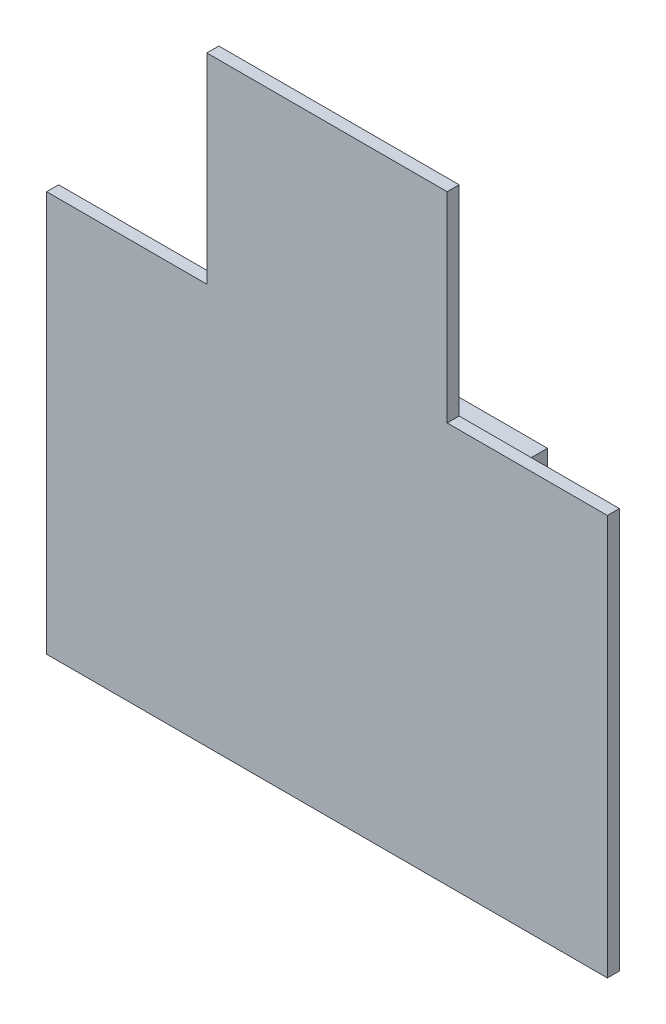
ISO-10303-21;
HEADER;
FILE_DESCRIPTION(('STEP AP214'),'2;1');
FILE_NAME('part.step','',(''),(''),'','','');
FILE_SCHEMA(('AUTOMOTIVE_DESIGN { 1 0 10303 214 1 1 1 1 }'));
ENDSEC;
DATA;
#1=APPLICATION_CONTEXT('core data for automotive mechanical design processes');
#2=APPLICATION_PROTOCOL_DEFINITION('international standard','automotive_design',2000,#1);
#3=PRODUCT_CONTEXT('',#1,'mechanical');
#4=PRODUCT('Part','Part','',(#3));
#5=PRODUCT_RELATED_PRODUCT_CATEGORY('part','',(#4));
#6=PRODUCT_DEFINITION_FORMATION('','',#4);
#7=PRODUCT_DEFINITION_CONTEXT('part definition',#1,'design');
#8=PRODUCT_DEFINITION('design','',#6,#7);
#9=PRODUCT_DEFINITION_SHAPE('','',#8);
#10=(LENGTH_UNIT() NAMED_UNIT(*) SI_UNIT(.MILLI.,.METRE.));
#11=(NAMED_UNIT(*) PLANE_ANGLE_UNIT() SI_UNIT($,.RADIAN.));
#12=(NAMED_UNIT(*) SI_UNIT($,.STERADIAN.) SOLID_ANGLE_UNIT());
#13=UNCERTAINTY_MEASURE_WITH_UNIT(LENGTH_MEASURE(1.E-05),#10,'distance_accuracy_value','');
#14=(GEOMETRIC_REPRESENTATION_CONTEXT(3) GLOBAL_UNCERTAINTY_ASSIGNED_CONTEXT((#13)) GLOBAL_UNIT_ASSIGNED_CONTEXT((#10,
#11,#12)) REPRESENTATION_CONTEXT('',''));
#15=CARTESIAN_POINT('',(0.,0.,0.));
#16=DIRECTION('',(0.,0.,1.));
#17=DIRECTION('',(1.,0.,0.));
#18=AXIS2_PLACEMENT_3D('',#15,#16,#17);
#19=CARTESIAN_POINT('',(0.,0.,0.));
#20=DIRECTION('',(0.,0.,-1.));
#21=DIRECTION('',(-1.,0.,0.));
#22=AXIS2_PLACEMENT_3D('',#19,#20,#21);
#23=PLANE('',#22);
#24=DIRECTION('',(0.,1.,0.));
#25=VECTOR('',#24,1.);
#26=CARTESIAN_POINT('',(-70.,-50.,0.));
#27=LINE('',#26,#25);
#28=CARTESIAN_POINT('',(-70.,-50.,0.));
#29=VERTEX_POINT('',#28);
#30=CARTESIAN_POINT('',(-70.,50.,0.));
#31=VERTEX_POINT('',#30);
#32=EDGE_CURVE('E180',#29,#31,#27,.T.);
#33=ORIENTED_EDGE('',*,*,#32,.T.);
#34=DIRECTION('',(1.,0.,0.));
#35=VECTOR('',#34,1.);
#36=CARTESIAN_POINT('',(-70.,50.,0.));
#37=LINE('',#36,#35);
#38=CARTESIAN_POINT('',(-30.,50.,0.));
#39=VERTEX_POINT('',#38);
#40=EDGE_CURVE('E197',#31,#39,#37,.T.);
#41=ORIENTED_EDGE('',*,*,#40,.T.);
#42=DIRECTION('',(0.,-1.,0.));
#43=VECTOR('',#42,1.);
#44=CARTESIAN_POINT('',(-30.,100.,0.));
#45=LINE('',#44,#43);
#46=CARTESIAN_POINT('',(-30.,100.,0.));
#47=VERTEX_POINT('',#46);
#48=EDGE_CURVE('E177',#47,#39,#45,.T.);
#49=ORIENTED_EDGE('',*,*,#48,.F.);
#50=DIRECTION('',(-1.,0.,0.));
#51=VECTOR('',#50,1.);
#52=CARTESIAN_POINT('',(30.,100.,0.));
#53=LINE('',#52,#51);
#54=CARTESIAN_POINT('',(30.,100.,0.));
#55=VERTEX_POINT('',#54);
#56=EDGE_CURVE('E158',#55,#47,#53,.T.);
#57=ORIENTED_EDGE('',*,*,#56,.F.);
#58=DIRECTION('',(0.,-1.,0.));
#59=VECTOR('',#58,1.);
#60=CARTESIAN_POINT('',(30.,100.,0.));
#61=LINE('',#60,#59);
#62=CARTESIAN_POINT('',(30.,50.,0.));
#63=VERTEX_POINT('',#62);
#64=EDGE_CURVE('E166',#55,#63,#61,.T.);
#65=ORIENTED_EDGE('',*,*,#64,.T.);
#66=CARTESIAN_POINT('',(70.,50.,0.));
#67=VERTEX_POINT('',#66);
#68=EDGE_CURVE('E196',#63,#67,#37,.T.);
#69=ORIENTED_EDGE('',*,*,#68,.T.);
#70=DIRECTION('',(0.,1.,0.));
#71=VECTOR('',#70,1.);
#72=CARTESIAN_POINT('',(70.,-50.,0.));
#73=LINE('',#72,#71);
#74=CARTESIAN_POINT('',(70.,-50.,0.));
#75=VERTEX_POINT('',#74);
#76=EDGE_CURVE('E200',#75,#67,#73,.T.);
#77=ORIENTED_EDGE('',*,*,#76,.F.);
#78=DIRECTION('',(1.,0.,0.));
#79=VECTOR('',#78,1.);
#80=CARTESIAN_POINT('',(-70.,-50.,0.));
#81=LINE('',#80,#79);
#82=EDGE_CURVE('E185',#29,#75,#81,.T.);
#83=ORIENTED_EDGE('',*,*,#82,.F.);
#84=EDGE_LOOP('',(#33,#41,#49,#57,#65,#69,#77,#83));
#85=FACE_BOUND('',#84,.T.);
#86=DIRECTION('',(-1.,0.,0.));
#87=VECTOR('',#86,1.);
#88=CARTESIAN_POINT('',(-32.0376232485771,-34.0531069573462,0.));
#89=LINE('',#88,#87);
#90=CARTESIAN_POINT('',(32.0376232485771,-34.0531069573462,0.));
#91=VERTEX_POINT('',#90);
#92=CARTESIAN_POINT('',(-32.0376232485771,-34.0531069573462,0.));
#93=VERTEX_POINT('',#92);
#94=EDGE_CURVE('E431',#91,#93,#89,.T.);
#95=ORIENTED_EDGE('',*,*,#94,.F.);
#96=DIRECTION('',(0.,-1.,0.));
#97=VECTOR('',#96,1.);
#98=CARTESIAN_POINT('',(32.0376232485771,34.0531069573462,0.));
#99=LINE('',#98,#97);
#100=CARTESIAN_POINT('',(32.0376232485771,34.0531069573462,0.));
#101=VERTEX_POINT('',#100);
#102=EDGE_CURVE('E149',#101,#91,#99,.T.);
#103=ORIENTED_EDGE('',*,*,#102,.F.);
#104=DIRECTION('',(1.,0.,0.));
#105=VECTOR('',#104,1.);
#106=CARTESIAN_POINT('',(-32.0376232485771,34.0531069573462,0.));
#107=LINE('',#106,#105);
#108=CARTESIAN_POINT('',(-32.0376232485771,34.0531069573462,0.));
#109=VERTEX_POINT('',#108);
#110=EDGE_CURVE('E145',#109,#101,#107,.T.);
#111=ORIENTED_EDGE('',*,*,#110,.F.);
#112=DIRECTION('',(0.,1.,0.));
#113=VECTOR('',#112,1.);
#114=CARTESIAN_POINT('',(-32.0376232485771,34.0531069573462,0.));
#115=LINE('',#114,#113);
#116=EDGE_CURVE('E433',#93,#109,#115,.T.);
#117=ORIENTED_EDGE('',*,*,#116,.F.);
#118=EDGE_LOOP('',(#95,#103,#111,#117));
#119=FACE_BOUND('',#118,.T.);
#120=ADVANCED_FACE('F37',(#85,#119),#23,.T.);
#121=CARTESIAN_POINT('',(-70.,50.,3.));
#122=DIRECTION('',(0.,1.,0.));
#123=DIRECTION('',(0.,0.,1.));
#124=AXIS2_PLACEMENT_3D('',#121,#122,#123);
#125=PLANE('',#124);
#126=DIRECTION('',(0.,0.,-1.));
#127=VECTOR('',#126,1.);
#128=CARTESIAN_POINT('',(30.,50.,0.));
#129=LINE('',#128,#127);
#130=CARTESIAN_POINT('',(30.,50.,3.));
#131=VERTEX_POINT('',#130);
#132=EDGE_CURVE('E60',#131,#63,#129,.T.);
#133=ORIENTED_EDGE('',*,*,#132,.F.);
#134=DIRECTION('',(1.,0.,0.));
#135=VECTOR('',#134,1.);
#136=CARTESIAN_POINT('',(-70.,50.,3.));
#137=LINE('',#136,#135);
#138=CARTESIAN_POINT('',(70.,50.,3.));
#139=VERTEX_POINT('',#138);
#140=EDGE_CURVE('E184',#131,#139,#137,.T.);
#141=ORIENTED_EDGE('',*,*,#140,.T.);
#142=DIRECTION('',(0.,0.,-1.));
#143=VECTOR('',#142,1.);
#144=CARTESIAN_POINT('',(70.,50.,3.));
#145=LINE('',#144,#143);
#146=EDGE_CURVE('E209',#139,#67,#145,.T.);
#147=ORIENTED_EDGE('',*,*,#146,.T.);
#148=ORIENTED_EDGE('',*,*,#68,.F.);
#149=EDGE_LOOP('',(#133,#141,#147,#148));
#150=FACE_BOUND('',#149,.T.);
#151=ADVANCED_FACE('F232',(#150),#125,.T.);
#152=CARTESIAN_POINT('',(-70.,-50.,3.));
#153=DIRECTION('',(-1.,0.,0.));
#154=DIRECTION('',(0.,0.,1.));
#155=AXIS2_PLACEMENT_3D('',#152,#153,#154);
#156=PLANE('',#155);
#157=ORIENTED_EDGE('',*,*,#32,.F.);
#158=DIRECTION('',(0.,0.,-1.));
#159=VECTOR('',#158,1.);
#160=CARTESIAN_POINT('',(-70.,-50.,3.));
#161=LINE('',#160,#159);
#162=CARTESIAN_POINT('',(-70.,-50.,3.));
#163=VERTEX_POINT('',#162);
#164=EDGE_CURVE('E204',#163,#29,#161,.T.);
#165=ORIENTED_EDGE('',*,*,#164,.F.);
#166=DIRECTION('',(0.,1.,0.));
#167=VECTOR('',#166,1.);
#168=CARTESIAN_POINT('',(-70.,-50.,3.));
#169=LINE('',#168,#167);
#170=CARTESIAN_POINT('',(-70.,50.,3.));
#171=VERTEX_POINT('',#170);
#172=EDGE_CURVE('E181',#163,#171,#169,.T.);
#173=ORIENTED_EDGE('',*,*,#172,.T.);
#174=DIRECTION('',(0.,0.,-1.));
#175=VECTOR('',#174,1.);
#176=CARTESIAN_POINT('',(-70.,50.,3.));
#177=LINE('',#176,#175);
#178=EDGE_CURVE('E193',#171,#31,#177,.T.);
#179=ORIENTED_EDGE('',*,*,#178,.T.);
#180=EDGE_LOOP('',(#157,#165,#173,#179));
#181=FACE_BOUND('',#180,.T.);
#182=ADVANCED_FACE('F39',(#181),#156,.T.);
#183=CARTESIAN_POINT('',(-70.,-50.,3.));
#184=DIRECTION('',(0.,1.,0.));
#185=DIRECTION('',(0.,0.,1.));
#186=AXIS2_PLACEMENT_3D('',#183,#184,#185);
#187=PLANE('',#186);
#188=ORIENTED_EDGE('',*,*,#82,.T.);
#189=DIRECTION('',(0.,0.,-1.));
#190=VECTOR('',#189,1.);
#191=CARTESIAN_POINT('',(70.,-50.,3.));
#192=LINE('',#191,#190);
#193=CARTESIAN_POINT('',(70.,-50.,3.));
#194=VERTEX_POINT('',#193);
#195=EDGE_CURVE('E206',#194,#75,#192,.T.);
#196=ORIENTED_EDGE('',*,*,#195,.F.);
#197=DIRECTION('',(1.,0.,0.));
#198=VECTOR('',#197,1.);
#199=CARTESIAN_POINT('',(-70.,-50.,3.));
#200=LINE('',#199,#198);
#201=EDGE_CURVE('E191',#163,#194,#200,.T.);
#202=ORIENTED_EDGE('',*,*,#201,.F.);
#203=ORIENTED_EDGE('',*,*,#164,.T.);
#204=EDGE_LOOP('',(#188,#196,#202,#203));
#205=FACE_BOUND('',#204,.T.);
#206=ADVANCED_FACE('F244',(#205),#187,.F.);
#207=CARTESIAN_POINT('',(70.,-50.,3.));
#208=DIRECTION('',(-1.,0.,0.));
#209=DIRECTION('',(0.,0.,1.));
#210=AXIS2_PLACEMENT_3D('',#207,#208,#209);
#211=PLANE('',#210);
#212=ORIENTED_EDGE('',*,*,#76,.T.);
#213=ORIENTED_EDGE('',*,*,#146,.F.);
#214=DIRECTION('',(0.,1.,0.));
#215=VECTOR('',#214,1.);
#216=CARTESIAN_POINT('',(70.,-50.,3.));
#217=LINE('',#216,#215);
#218=EDGE_CURVE('E188',#194,#139,#217,.T.);
#219=ORIENTED_EDGE('',*,*,#218,.F.);
#220=ORIENTED_EDGE('',*,*,#195,.T.);
#221=EDGE_LOOP('',(#212,#213,#219,#220));
#222=FACE_BOUND('',#221,.T.);
#223=ADVANCED_FACE('F247',(#222),#211,.F.);
#224=DIRECTION('',(0.,0.,1.));
#225=VECTOR('',#224,1.);
#226=CARTESIAN_POINT('',(-30.,50.,0.));
#227=LINE('',#226,#225);
#228=CARTESIAN_POINT('',(-30.,50.,3.));
#229=VERTEX_POINT('',#228);
#230=EDGE_CURVE('E151',#39,#229,#227,.T.);
#231=ORIENTED_EDGE('',*,*,#230,.F.);
#232=ORIENTED_EDGE('',*,*,#40,.F.);
#233=ORIENTED_EDGE('',*,*,#178,.F.);
#234=EDGE_CURVE('E186',#171,#229,#137,.T.);
#235=ORIENTED_EDGE('',*,*,#234,.T.);
#236=EDGE_LOOP('',(#231,#232,#233,#235));
#237=FACE_BOUND('',#236,.T.);
#238=ADVANCED_FACE('F238',(#237),#125,.T.);
#239=CARTESIAN_POINT('',(0.,0.,3.));
#240=DIRECTION('',(0.,0.,-1.));
#241=DIRECTION('',(-1.,0.,0.));
#242=AXIS2_PLACEMENT_3D('',#239,#240,#241);
#243=PLANE('',#242);
#244=ORIENTED_EDGE('',*,*,#172,.F.);
#245=ORIENTED_EDGE('',*,*,#201,.T.);
#246=ORIENTED_EDGE('',*,*,#218,.T.);
#247=ORIENTED_EDGE('',*,*,#140,.F.);
#248=DIRECTION('',(0.,-1.,0.));
#249=VECTOR('',#248,1.);
#250=CARTESIAN_POINT('',(30.,100.,3.));
#251=LINE('',#250,#249);
#252=CARTESIAN_POINT('',(30.,100.,3.));
#253=VERTEX_POINT('',#252);
#254=EDGE_CURVE('E171',#253,#131,#251,.T.);
#255=ORIENTED_EDGE('',*,*,#254,.F.);
#256=DIRECTION('',(1.,0.,0.));
#257=VECTOR('',#256,1.);
#258=CARTESIAN_POINT('',(-30.,100.,3.));
#259=LINE('',#258,#257);
#260=CARTESIAN_POINT('',(-30.,100.,3.));
#261=VERTEX_POINT('',#260);
#262=EDGE_CURVE('E163',#261,#253,#259,.T.);
#263=ORIENTED_EDGE('',*,*,#262,.F.);
#264=DIRECTION('',(0.,-1.,0.));
#265=VECTOR('',#264,1.);
#266=CARTESIAN_POINT('',(-30.,100.,3.));
#267=LINE('',#266,#265);
#268=EDGE_CURVE('E174',#261,#229,#267,.T.);
#269=ORIENTED_EDGE('',*,*,#268,.T.);
#270=ORIENTED_EDGE('',*,*,#234,.F.);
#271=EDGE_LOOP('',(#244,#245,#246,#247,#255,#263,#269,#270));
#272=FACE_BOUND('',#271,.T.);
#273=ADVANCED_FACE('F242',(#272),#243,.F.);
#274=CARTESIAN_POINT('',(-30.,100.,0.));
#275=DIRECTION('',(1.,0.,0.));
#276=DIRECTION('',(0.,0.,-1.));
#277=AXIS2_PLACEMENT_3D('',#274,#275,#276);
#278=PLANE('',#277);
#279=ORIENTED_EDGE('',*,*,#230,.T.);
#280=ORIENTED_EDGE('',*,*,#268,.F.);
#281=DIRECTION('',(0.,0.,1.));
#282=VECTOR('',#281,1.);
#283=CARTESIAN_POINT('',(-30.,100.,0.));
#284=LINE('',#283,#282);
#285=EDGE_CURVE('E161',#47,#261,#284,.T.);
#286=ORIENTED_EDGE('',*,*,#285,.F.);
#287=ORIENTED_EDGE('',*,*,#48,.T.);
#288=EDGE_LOOP('',(#279,#280,#286,#287));
#289=FACE_BOUND('',#288,.T.);
#290=ADVANCED_FACE('F256',(#289),#278,.F.);
#291=CARTESIAN_POINT('',(30.,100.,0.));
#292=DIRECTION('',(-1.,0.,0.));
#293=DIRECTION('',(0.,0.,1.));
#294=AXIS2_PLACEMENT_3D('',#291,#292,#293);
#295=PLANE('',#294);
#296=ORIENTED_EDGE('',*,*,#132,.T.);
#297=ORIENTED_EDGE('',*,*,#64,.F.);
#298=DIRECTION('',(0.,0.,-1.));
#299=VECTOR('',#298,1.);
#300=CARTESIAN_POINT('',(30.,100.,0.));
#301=LINE('',#300,#299);
#302=EDGE_CURVE('E165',#253,#55,#301,.T.);
#303=ORIENTED_EDGE('',*,*,#302,.F.);
#304=ORIENTED_EDGE('',*,*,#254,.T.);
#305=EDGE_LOOP('',(#296,#297,#303,#304));
#306=FACE_BOUND('',#305,.T.);
#307=ADVANCED_FACE('F273',(#306),#295,.F.);
#308=CARTESIAN_POINT('',(0.,100.,0.));
#309=DIRECTION('',(0.,1.,0.));
#310=DIRECTION('',(0.,0.,1.));
#311=AXIS2_PLACEMENT_3D('',#308,#309,#310);
#312=PLANE('',#311);
#313=ORIENTED_EDGE('',*,*,#56,.T.);
#314=ORIENTED_EDGE('',*,*,#285,.T.);
#315=ORIENTED_EDGE('',*,*,#262,.T.);
#316=ORIENTED_EDGE('',*,*,#302,.T.);
#317=EDGE_LOOP('',(#313,#314,#315,#316));
#318=FACE_BOUND('',#317,.T.);
#319=ADVANCED_FACE('F268',(#318),#312,.T.);
#320=CARTESIAN_POINT('',(32.0376232485771,34.0531069573462,-20.));
#321=DIRECTION('',(-1.,0.,0.));
#322=DIRECTION('',(0.,0.,1.));
#323=AXIS2_PLACEMENT_3D('',#320,#321,#322);
#324=PLANE('',#323);
#325=ORIENTED_EDGE('',*,*,#102,.T.);
#326=DIRECTION('',(0.,0.,1.));
#327=VECTOR('',#326,1.);
#328=CARTESIAN_POINT('',(32.0376232485771,-34.0531069573462,-20.));
#329=LINE('',#328,#327);
#330=CARTESIAN_POINT('',(32.0376232485771,-34.0531069573462,-20.));
#331=VERTEX_POINT('',#330);
#332=EDGE_CURVE('E130',#331,#91,#329,.T.);
#333=ORIENTED_EDGE('',*,*,#332,.F.);
#334=DIRECTION('',(0.,-1.,0.));
#335=VECTOR('',#334,1.);
#336=CARTESIAN_POINT('',(32.0376232485771,34.0531069573462,-20.));
#337=LINE('',#336,#335);
#338=CARTESIAN_POINT('',(32.0376232485771,34.0531069573462,-20.));
#339=VERTEX_POINT('',#338);
#340=EDGE_CURVE('E137',#339,#331,#337,.T.);
#341=ORIENTED_EDGE('',*,*,#340,.F.);
#342=DIRECTION('',(0.,0.,1.));
#343=VECTOR('',#342,1.);
#344=CARTESIAN_POINT('',(32.0376232485771,34.0531069573462,-20.));
#345=LINE('',#344,#343);
#346=EDGE_CURVE('E429',#339,#101,#345,.T.);
#347=ORIENTED_EDGE('',*,*,#346,.T.);
#348=EDGE_LOOP('',(#325,#333,#341,#347));
#349=FACE_BOUND('',#348,.T.);
#350=ADVANCED_FACE('F147',(#349),#324,.F.);
#351=CARTESIAN_POINT('',(-32.0376232485771,-34.0531069573462,-20.));
#352=DIRECTION('',(0.,1.,0.));
#353=DIRECTION('',(0.,0.,1.));
#354=AXIS2_PLACEMENT_3D('',#351,#352,#353);
#355=PLANE('',#354);
#356=ORIENTED_EDGE('',*,*,#94,.T.);
#357=DIRECTION('',(0.,0.,1.));
#358=VECTOR('',#357,1.);
#359=CARTESIAN_POINT('',(-32.0376232485771,-34.0531069573462,-20.));
#360=LINE('',#359,#358);
#361=CARTESIAN_POINT('',(-32.0376232485771,-34.0531069573462,-20.));
#362=VERTEX_POINT('',#361);
#363=EDGE_CURVE('E133',#362,#93,#360,.T.);
#364=ORIENTED_EDGE('',*,*,#363,.F.);
#365=DIRECTION('',(-1.,0.,0.));
#366=VECTOR('',#365,1.);
#367=CARTESIAN_POINT('',(-32.0376232485771,-34.0531069573462,-20.));
#368=LINE('',#367,#366);
#369=EDGE_CURVE('E126',#331,#362,#368,.T.);
#370=ORIENTED_EDGE('',*,*,#369,.F.);
#371=ORIENTED_EDGE('',*,*,#332,.T.);
#372=EDGE_LOOP('',(#356,#364,#370,#371));
#373=FACE_BOUND('',#372,.T.);
#374=ADVANCED_FACE('F128',(#373),#355,.F.);
#375=CARTESIAN_POINT('',(-32.0376232485771,34.0531069573462,-20.));
#376=DIRECTION('',(1.,0.,0.));
#377=DIRECTION('',(0.,0.,-1.));
#378=AXIS2_PLACEMENT_3D('',#375,#376,#377);
#379=PLANE('',#378);
#380=ORIENTED_EDGE('',*,*,#116,.T.);
#381=DIRECTION('',(0.,0.,1.));
#382=VECTOR('',#381,1.);
#383=CARTESIAN_POINT('',(-32.0376232485771,34.0531069573462,-20.));
#384=LINE('',#383,#382);
#385=CARTESIAN_POINT('',(-32.0376232485771,34.0531069573462,-20.));
#386=VERTEX_POINT('',#385);
#387=EDGE_CURVE('E52',#386,#109,#384,.T.);
#388=ORIENTED_EDGE('',*,*,#387,.F.);
#389=DIRECTION('',(0.,1.,0.));
#390=VECTOR('',#389,1.);
#391=CARTESIAN_POINT('',(-32.0376232485771,34.0531069573462,-20.));
#392=LINE('',#391,#390);
#393=EDGE_CURVE('E136',#362,#386,#392,.T.);
#394=ORIENTED_EDGE('',*,*,#393,.F.);
#395=ORIENTED_EDGE('',*,*,#363,.T.);
#396=EDGE_LOOP('',(#380,#388,#394,#395));
#397=FACE_BOUND('',#396,.T.);
#398=ADVANCED_FACE('F228',(#397),#379,.F.);
#399=CARTESIAN_POINT('',(-32.0376232485771,34.0531069573462,-20.));
#400=DIRECTION('',(0.,-1.,0.));
#401=DIRECTION('',(0.,0.,-1.));
#402=AXIS2_PLACEMENT_3D('',#399,#400,#401);
#403=PLANE('',#402);
#404=ORIENTED_EDGE('',*,*,#110,.T.);
#405=ORIENTED_EDGE('',*,*,#346,.F.);
#406=DIRECTION('',(1.,0.,0.));
#407=VECTOR('',#406,1.);
#408=CARTESIAN_POINT('',(-32.0376232485771,34.0531069573462,-20.));
#409=LINE('',#408,#407);
#410=EDGE_CURVE('E141',#386,#339,#409,.T.);
#411=ORIENTED_EDGE('',*,*,#410,.F.);
#412=ORIENTED_EDGE('',*,*,#387,.T.);
#413=EDGE_LOOP('',(#404,#405,#411,#412));
#414=FACE_BOUND('',#413,.T.);
#415=ADVANCED_FACE('F218',(#414),#403,.F.);
#416=CARTESIAN_POINT('',(0.,0.,-20.));
#417=DIRECTION('',(0.,0.,1.));
#418=DIRECTION('',(1.,0.,0.));
#419=AXIS2_PLACEMENT_3D('',#416,#417,#418);
#420=PLANE('',#419);
#421=CARTESIAN_POINT('',(15.8373028707146,0.,-20.));
#422=DIRECTION('',(0.,0.,1.));
#423=DIRECTION('',(1.,0.,0.));
#424=AXIS2_PLACEMENT_3D('',#421,#422,#423);
#425=CIRCLE('',#424,7.43322974572696);
#426=CARTESIAN_POINT('',(23.2705326164416,0.,-20.));
#427=VERTEX_POINT('',#426);
#428=EDGE_CURVE('E11',#427,#427,#425,.F.);
#429=ORIENTED_EDGE('',*,*,#428,.F.);
#430=EDGE_LOOP('',(#429));
#431=FACE_BOUND('',#430,.T.);
#432=CARTESIAN_POINT('',(-17.8741791806232,0.,-20.));
#433=DIRECTION('',(0.,0.,1.));
#434=DIRECTION('',(1.,0.,0.));
#435=AXIS2_PLACEMENT_3D('',#432,#433,#434);
#436=CIRCLE('',#435,7.43322974572696);
#437=CARTESIAN_POINT('',(-10.4409494348962,0.,-20.));
#438=VERTEX_POINT('',#437);
#439=EDGE_CURVE('E45',#438,#438,#436,.F.);
#440=ORIENTED_EDGE('',*,*,#439,.F.);
#441=EDGE_LOOP('',(#440));
#442=FACE_BOUND('',#441,.T.);
#443=ORIENTED_EDGE('',*,*,#340,.T.);
#444=ORIENTED_EDGE('',*,*,#369,.T.);
#445=ORIENTED_EDGE('',*,*,#393,.T.);
#446=ORIENTED_EDGE('',*,*,#410,.T.);
#447=EDGE_LOOP('',(#443,#444,#445,#446));
#448=FACE_BOUND('',#447,.T.);
#449=ADVANCED_FACE('F140',(#431,#442,#448),#420,.F.);
#450=CARTESIAN_POINT('',(-17.8741791806232,0.,-30.));
#451=DIRECTION('',(0.,0.,1.));
#452=DIRECTION('',(1.,0.,0.));
#453=AXIS2_PLACEMENT_3D('',#450,#451,#452);
#454=CYLINDRICAL_SURFACE('',#453,7.43322974572696);
#455=CARTESIAN_POINT('',(-17.8741791806232,0.,-30.));
#456=DIRECTION('',(0.,0.,-1.));
#457=DIRECTION('',(-1.,0.,0.));
#458=AXIS2_PLACEMENT_3D('',#455,#456,#457);
#459=CIRCLE('',#458,7.43322974572696);
#460=CARTESIAN_POINT('',(-25.3074089263501,0.,-30.));
#461=VERTEX_POINT('',#460);
#462=EDGE_CURVE('E422',#461,#461,#459,.T.);
#463=ORIENTED_EDGE('',*,*,#462,.F.);
#464=EDGE_LOOP('',(#463));
#465=FACE_BOUND('',#464,.T.);
#466=ORIENTED_EDGE('',*,*,#439,.T.);
#467=EDGE_LOOP('',(#466));
#468=FACE_BOUND('',#467,.T.);
#469=ADVANCED_FACE('F215',(#465,#468),#454,.T.);
#470=CARTESIAN_POINT('',(-17.8741791806232,0.,-30.));
#471=DIRECTION('',(0.,0.,-1.));
#472=DIRECTION('',(-1.,0.,0.));
#473=AXIS2_PLACEMENT_3D('',#470,#471,#472);
#474=PLANE('',#473);
#475=ORIENTED_EDGE('',*,*,#462,.T.);
#476=EDGE_LOOP('',(#475));
#477=FACE_BOUND('',#476,.T.);
#478=ADVANCED_FACE('F225',(#477),#474,.T.);
#479=CARTESIAN_POINT('',(15.8373028707146,0.,-30.));
#480=DIRECTION('',(0.,0.,1.));
#481=DIRECTION('',(1.,0.,0.));
#482=AXIS2_PLACEMENT_3D('',#479,#480,#481);
#483=CYLINDRICAL_SURFACE('',#482,7.43322974572696);
#484=CARTESIAN_POINT('',(15.8373028707146,0.,-30.));
#485=DIRECTION('',(0.,0.,-1.));
#486=DIRECTION('',(-1.,0.,0.));
#487=AXIS2_PLACEMENT_3D('',#484,#485,#486);
#488=CIRCLE('',#487,7.43322974572696);
#489=CARTESIAN_POINT('',(8.40407312498765,0.,-30.));
#490=VERTEX_POINT('',#489);
#491=EDGE_CURVE('E421',#490,#490,#488,.T.);
#492=ORIENTED_EDGE('',*,*,#491,.F.);
#493=EDGE_LOOP('',(#492));
#494=FACE_BOUND('',#493,.T.);
#495=ORIENTED_EDGE('',*,*,#428,.T.);
#496=EDGE_LOOP('',(#495));
#497=FACE_BOUND('',#496,.T.);
#498=ADVANCED_FACE('F390',(#494,#497),#483,.T.);
#499=CARTESIAN_POINT('',(15.8373028707146,0.,-30.));
#500=DIRECTION('',(0.,0.,-1.));
#501=DIRECTION('',(-1.,0.,0.));
#502=AXIS2_PLACEMENT_3D('',#499,#500,#501);
#503=PLANE('',#502);
#504=ORIENTED_EDGE('',*,*,#491,.T.);
#505=EDGE_LOOP('',(#504));
#506=FACE_BOUND('',#505,.T.);
#507=ADVANCED_FACE('F400',(#506),#503,.T.);
#508=CLOSED_SHELL('',(#120,#151,#182,#206,#223,#238,#273,#290,#307,#319,#350,#374,#398,#415,
#449,#469,#478,#498,#507));
#509=MANIFOLD_SOLID_BREP('B2',#508);
#510=ADVANCED_BREP_SHAPE_REPRESENTATION('',(#18,#509),#14);
#511=SHAPE_DEFINITION_REPRESENTATION(#9,#510);
ENDSEC;
END-ISO-10303-21;
